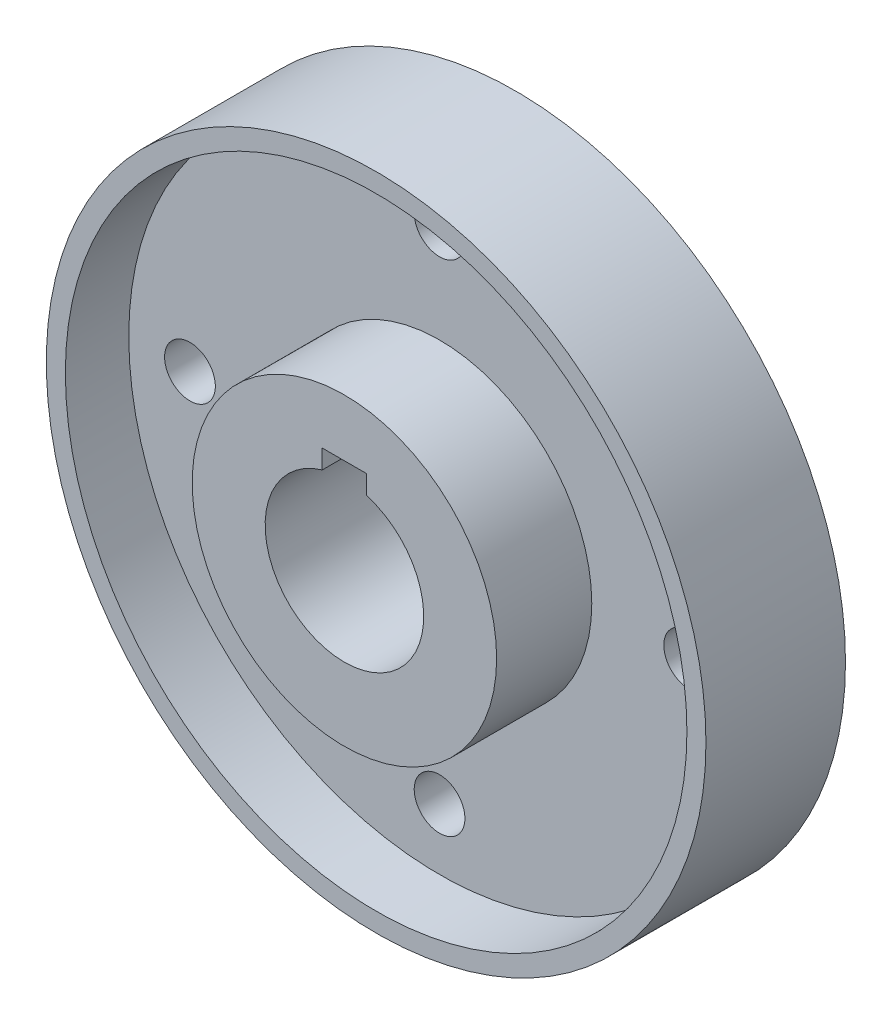
ISO-10303-21;
HEADER;
FILE_DESCRIPTION(('STEP AP214'),'2;1');
FILE_NAME('part.step','',(''),(''),'','','');
FILE_SCHEMA(('AUTOMOTIVE_DESIGN { 1 0 10303 214 1 1 1 1 }'));
ENDSEC;
DATA;
#1=APPLICATION_CONTEXT('core data for automotive mechanical design processes');
#2=APPLICATION_PROTOCOL_DEFINITION('international standard','automotive_design',2000,#1);
#3=PRODUCT_CONTEXT('',#1,'mechanical');
#4=PRODUCT('Part','Part','',(#3));
#5=PRODUCT_RELATED_PRODUCT_CATEGORY('part','',(#4));
#6=PRODUCT_DEFINITION_FORMATION('','',#4);
#7=PRODUCT_DEFINITION_CONTEXT('part definition',#1,'design');
#8=PRODUCT_DEFINITION('design','',#6,#7);
#9=PRODUCT_DEFINITION_SHAPE('','',#8);
#10=(LENGTH_UNIT() NAMED_UNIT(*) SI_UNIT(.MILLI.,.METRE.));
#11=(NAMED_UNIT(*) PLANE_ANGLE_UNIT() SI_UNIT($,.RADIAN.));
#12=(NAMED_UNIT(*) SI_UNIT($,.STERADIAN.) SOLID_ANGLE_UNIT());
#13=UNCERTAINTY_MEASURE_WITH_UNIT(LENGTH_MEASURE(1.E-05),#10,'distance_accuracy_value','');
#14=(GEOMETRIC_REPRESENTATION_CONTEXT(3) GLOBAL_UNCERTAINTY_ASSIGNED_CONTEXT((#13)) GLOBAL_UNIT_ASSIGNED_CONTEXT((#10,
#11,#12)) REPRESENTATION_CONTEXT('',''));
#15=CARTESIAN_POINT('',(0.,0.,0.));
#16=DIRECTION('',(0.,0.,1.));
#17=DIRECTION('',(1.,0.,0.));
#18=AXIS2_PLACEMENT_3D('',#15,#16,#17);
#19=CARTESIAN_POINT('',(0.,104.,0.));
#20=DIRECTION('',(0.,0.,1.));
#21=DIRECTION('',(1.,0.,0.));
#22=AXIS2_PLACEMENT_3D('',#19,#20,#21);
#23=PLANE('',#22);
#24=CARTESIAN_POINT('',(0.,-78.7044474679823,0.));
#25=DIRECTION('',(0.,0.,1.));
#26=DIRECTION('',(-1.,0.,0.));
#27=AXIS2_PLACEMENT_3D('',#24,#25,#26);
#28=CIRCLE('',#27,8.);
#29=CARTESIAN_POINT('',(-8.,-78.7044474679823,0.));
#30=VERTEX_POINT('',#29);
#31=EDGE_CURVE('E143',#30,#30,#28,.T.);
#32=ORIENTED_EDGE('',*,*,#31,.T.);
#33=EDGE_LOOP('',(#32));
#34=FACE_BOUND('',#33,.T.);
#35=CARTESIAN_POINT('',(0.,78.7044474679823,0.));
#36=DIRECTION('',(0.,0.,1.));
#37=DIRECTION('',(1.,0.,0.));
#38=AXIS2_PLACEMENT_3D('',#35,#36,#37);
#39=CIRCLE('',#38,8.);
#40=CARTESIAN_POINT('',(8.,78.7044474679823,0.));
#41=VERTEX_POINT('',#40);
#42=EDGE_CURVE('E137',#41,#41,#39,.T.);
#43=ORIENTED_EDGE('',*,*,#42,.T.);
#44=EDGE_LOOP('',(#43));
#45=FACE_BOUND('',#44,.T.);
#46=CARTESIAN_POINT('',(0.,0.,0.));
#47=DIRECTION('',(0.,0.,1.));
#48=DIRECTION('',(1.,0.,0.));
#49=AXIS2_PLACEMENT_3D('',#46,#47,#48);
#50=CIRCLE('',#49,104.);
#51=CARTESIAN_POINT('',(104.,0.,0.));
#52=VERTEX_POINT('',#51);
#53=EDGE_CURVE('E126',#52,#52,#50,.T.);
#54=ORIENTED_EDGE('',*,*,#53,.F.);
#55=EDGE_LOOP('',(#54));
#56=FACE_BOUND('',#55,.T.);
#57=CARTESIAN_POINT('',(0.,0.,0.));
#58=DIRECTION('',(0.,0.,1.));
#59=DIRECTION('',(1.,0.,0.));
#60=AXIS2_PLACEMENT_3D('',#57,#58,#59);
#61=CIRCLE('',#60,48.);
#62=CARTESIAN_POINT('',(48.,0.,0.));
#63=VERTEX_POINT('',#62);
#64=EDGE_CURVE('E123',#63,#63,#61,.T.);
#65=ORIENTED_EDGE('',*,*,#64,.T.);
#66=EDGE_LOOP('',(#65));
#67=FACE_BOUND('',#66,.T.);
#68=CARTESIAN_POINT('',(-78.7044474679823,-2.7479510961842E-13,0.));
#69=DIRECTION('',(0.,0.,1.));
#70=DIRECTION('',(0.,1.,0.));
#71=AXIS2_PLACEMENT_3D('',#68,#69,#70);
#72=CIRCLE('',#71,8.);
#73=CARTESIAN_POINT('',(-78.7044474679823,7.99999999999973,0.));
#74=VERTEX_POINT('',#73);
#75=EDGE_CURVE('E140',#74,#74,#72,.T.);
#76=ORIENTED_EDGE('',*,*,#75,.T.);
#77=EDGE_LOOP('',(#76));
#78=FACE_BOUND('',#77,.T.);
#79=CARTESIAN_POINT('',(78.7044474679823,8.24385328855259E-13,0.));
#80=DIRECTION('',(0.,0.,1.));
#81=DIRECTION('',(0.,-1.,0.));
#82=AXIS2_PLACEMENT_3D('',#79,#80,#81);
#83=CIRCLE('',#82,8.);
#84=CARTESIAN_POINT('',(78.7044474679824,-7.99999999999918,0.));
#85=VERTEX_POINT('',#84);
#86=EDGE_CURVE('E153',#85,#85,#83,.T.);
#87=ORIENTED_EDGE('',*,*,#86,.T.);
#88=EDGE_LOOP('',(#87));
#89=FACE_BOUND('',#88,.T.);
#90=ADVANCED_FACE('F37',(#34,#45,#56,#67,#78,#89),#23,.F.);
#91=CARTESIAN_POINT('',(0.,48.,24.));
#92=DIRECTION('',(0.,0.,-1.));
#93=DIRECTION('',(-1.,0.,0.));
#94=AXIS2_PLACEMENT_3D('',#91,#92,#93);
#95=PLANE('',#94);
#96=CARTESIAN_POINT('',(0.,-78.7044474679823,24.));
#97=DIRECTION('',(0.,0.,-1.));
#98=DIRECTION('',(-1.,0.,0.));
#99=AXIS2_PLACEMENT_3D('',#96,#97,#98);
#100=CIRCLE('',#99,8.);
#101=CARTESIAN_POINT('',(-8.,-78.7044474679823,24.));
#102=VERTEX_POINT('',#101);
#103=EDGE_CURVE('E141',#102,#102,#100,.F.);
#104=ORIENTED_EDGE('',*,*,#103,.F.);
#105=EDGE_LOOP('',(#104));
#106=FACE_BOUND('',#105,.T.);
#107=CARTESIAN_POINT('',(0.,78.7044474679823,24.));
#108=DIRECTION('',(0.,0.,-1.));
#109=DIRECTION('',(-1.,0.,0.));
#110=AXIS2_PLACEMENT_3D('',#107,#108,#109);
#111=CIRCLE('',#110,8.);
#112=CARTESIAN_POINT('',(-8.,78.7044474679823,24.));
#113=VERTEX_POINT('',#112);
#114=EDGE_CURVE('E94',#113,#113,#111,.F.);
#115=ORIENTED_EDGE('',*,*,#114,.F.);
#116=EDGE_LOOP('',(#115));
#117=FACE_BOUND('',#116,.T.);
#118=CARTESIAN_POINT('',(0.,0.,24.));
#119=DIRECTION('',(0.,0.,1.));
#120=DIRECTION('',(1.,0.,0.));
#121=AXIS2_PLACEMENT_3D('',#118,#119,#120);
#122=CIRCLE('',#121,48.);
#123=CARTESIAN_POINT('',(48.,0.,24.));
#124=VERTEX_POINT('',#123);
#125=EDGE_CURVE('E109',#124,#124,#122,.T.);
#126=ORIENTED_EDGE('',*,*,#125,.F.);
#127=EDGE_LOOP('',(#126));
#128=FACE_BOUND('',#127,.T.);
#129=CARTESIAN_POINT('',(0.,0.,24.));
#130=DIRECTION('',(0.,0.,1.));
#131=DIRECTION('',(1.,0.,0.));
#132=AXIS2_PLACEMENT_3D('',#129,#130,#131);
#133=CIRCLE('',#132,98.);
#134=CARTESIAN_POINT('',(98.,0.,24.));
#135=VERTEX_POINT('',#134);
#136=EDGE_CURVE('E106',#135,#135,#133,.T.);
#137=ORIENTED_EDGE('',*,*,#136,.T.);
#138=EDGE_LOOP('',(#137));
#139=FACE_BOUND('',#138,.T.);
#140=CARTESIAN_POINT('',(-78.7044474679823,-2.7479510961842E-13,24.));
#141=DIRECTION('',(0.,0.,-1.));
#142=DIRECTION('',(-1.,0.,0.));
#143=AXIS2_PLACEMENT_3D('',#140,#141,#142);
#144=CIRCLE('',#143,8.);
#145=CARTESIAN_POINT('',(-86.7044474679823,-2.7479510961842E-13,24.));
#146=VERTEX_POINT('',#145);
#147=EDGE_CURVE('E138',#146,#146,#144,.F.);
#148=ORIENTED_EDGE('',*,*,#147,.F.);
#149=EDGE_LOOP('',(#148));
#150=FACE_BOUND('',#149,.T.);
#151=CARTESIAN_POINT('',(78.7044474679823,8.24385328855259E-13,24.));
#152=DIRECTION('',(0.,0.,-1.));
#153=DIRECTION('',(-1.,0.,0.));
#154=AXIS2_PLACEMENT_3D('',#151,#152,#153);
#155=CIRCLE('',#154,8.);
#156=CARTESIAN_POINT('',(70.7044474679823,8.24385328855259E-13,24.));
#157=VERTEX_POINT('',#156);
#158=EDGE_CURVE('E41',#157,#157,#155,.F.);
#159=ORIENTED_EDGE('',*,*,#158,.F.);
#160=EDGE_LOOP('',(#159));
#161=FACE_BOUND('',#160,.T.);
#162=ADVANCED_FACE('F173',(#106,#117,#128,#139,#150,#161),#95,.F.);
#163=CARTESIAN_POINT('',(0.,48.,5.));
#164=DIRECTION('',(0.,0.,1.));
#165=DIRECTION('',(1.,0.,0.));
#166=AXIS2_PLACEMENT_3D('',#163,#164,#165);
#167=PLANE('',#166);
#168=CARTESIAN_POINT('',(0.,0.,5.));
#169=DIRECTION('',(0.,0.,1.));
#170=DIRECTION('',(1.,0.,0.));
#171=AXIS2_PLACEMENT_3D('',#168,#169,#170);
#172=CIRCLE('',#171,48.);
#173=CARTESIAN_POINT('',(48.,0.,5.));
#174=VERTEX_POINT('',#173);
#175=EDGE_CURVE('E120',#174,#174,#172,.T.);
#176=ORIENTED_EDGE('',*,*,#175,.F.);
#177=EDGE_LOOP('',(#176));
#178=FACE_BOUND('',#177,.T.);
#179=DIRECTION('',(0.,-1.,0.));
#180=VECTOR('',#179,1.);
#181=CARTESIAN_POINT('',(7.,48.,5.));
#182=LINE('',#181,#180);
#183=CARTESIAN_POINT('',(7.,30.,5.));
#184=VERTEX_POINT('',#183);
#185=CARTESIAN_POINT('',(7.,24.,5.));
#186=VERTEX_POINT('',#185);
#187=EDGE_CURVE('E62',#184,#186,#182,.T.);
#188=ORIENTED_EDGE('',*,*,#187,.F.);
#189=DIRECTION('',(1.,0.,0.));
#190=VECTOR('',#189,1.);
#191=CARTESIAN_POINT('',(0.,30.,5.));
#192=LINE('',#191,#190);
#193=CARTESIAN_POINT('',(-7.,30.,5.));
#194=VERTEX_POINT('',#193);
#195=EDGE_CURVE('E86',#194,#184,#192,.T.);
#196=ORIENTED_EDGE('',*,*,#195,.F.);
#197=DIRECTION('',(0.,1.,0.));
#198=VECTOR('',#197,1.);
#199=CARTESIAN_POINT('',(-7.,48.,5.));
#200=LINE('',#199,#198);
#201=CARTESIAN_POINT('',(-7.,24.,5.));
#202=VERTEX_POINT('',#201);
#203=EDGE_CURVE('E78',#202,#194,#200,.T.);
#204=ORIENTED_EDGE('',*,*,#203,.F.);
#205=CARTESIAN_POINT('',(0.,0.,5.));
#206=DIRECTION('',(0.,0.,1.));
#207=DIRECTION('',(1.,0.,0.));
#208=AXIS2_PLACEMENT_3D('',#205,#206,#207);
#209=CIRCLE('',#208,25.);
#210=EDGE_CURVE('E118',#202,#186,#209,.T.);
#211=ORIENTED_EDGE('',*,*,#210,.T.);
#212=EDGE_LOOP('',(#188,#196,#204,#211));
#213=FACE_BOUND('',#212,.T.);
#214=ADVANCED_FACE('F96',(#178,#213),#167,.F.);
#215=CARTESIAN_POINT('',(0.,0.,52.4964718515854));
#216=DIRECTION('',(0.,0.,1.));
#217=DIRECTION('',(1.,0.,0.));
#218=AXIS2_PLACEMENT_3D('',#215,#216,#217);
#219=CYLINDRICAL_SURFACE('',#218,25.);
#220=DIRECTION('',(0.,0.,1.));
#221=VECTOR('',#220,1.);
#222=CARTESIAN_POINT('',(7.,24.,52.4964718515854));
#223=LINE('',#222,#221);
#224=CARTESIAN_POINT('',(7.,24.,54.));
#225=VERTEX_POINT('',#224);
#226=EDGE_CURVE('E97',#186,#225,#223,.T.);
#227=ORIENTED_EDGE('',*,*,#226,.F.);
#228=ORIENTED_EDGE('',*,*,#210,.F.);
#229=DIRECTION('',(0.,0.,1.));
#230=VECTOR('',#229,1.);
#231=CARTESIAN_POINT('',(-7.,24.,52.4964718515854));
#232=LINE('',#231,#230);
#233=CARTESIAN_POINT('',(-7.,24.,54.));
#234=VERTEX_POINT('',#233);
#235=EDGE_CURVE('E81',#234,#202,#232,.F.);
#236=ORIENTED_EDGE('',*,*,#235,.F.);
#237=CARTESIAN_POINT('',(0.,0.,54.));
#238=DIRECTION('',(0.,0.,1.));
#239=DIRECTION('',(1.,0.,0.));
#240=AXIS2_PLACEMENT_3D('',#237,#238,#239);
#241=CIRCLE('',#240,25.);
#242=EDGE_CURVE('E115',#234,#225,#241,.T.);
#243=ORIENTED_EDGE('',*,*,#242,.T.);
#244=EDGE_LOOP('',(#227,#228,#236,#243));
#245=FACE_BOUND('',#244,.T.);
#246=ADVANCED_FACE('F164',(#245),#219,.F.);
#247=CARTESIAN_POINT('',(0.,25.,54.));
#248=DIRECTION('',(0.,0.,-1.));
#249=DIRECTION('',(-1.,0.,0.));
#250=AXIS2_PLACEMENT_3D('',#247,#248,#249);
#251=PLANE('',#250);
#252=CARTESIAN_POINT('',(0.,0.,54.));
#253=DIRECTION('',(0.,0.,1.));
#254=DIRECTION('',(1.,0.,0.));
#255=AXIS2_PLACEMENT_3D('',#252,#253,#254);
#256=CIRCLE('',#255,48.);
#257=CARTESIAN_POINT('',(48.,0.,54.));
#258=VERTEX_POINT('',#257);
#259=EDGE_CURVE('E112',#258,#258,#256,.T.);
#260=ORIENTED_EDGE('',*,*,#259,.T.);
#261=EDGE_LOOP('',(#260));
#262=FACE_BOUND('',#261,.T.);
#263=DIRECTION('',(0.,1.,0.));
#264=VECTOR('',#263,1.);
#265=CARTESIAN_POINT('',(7.,25.,54.));
#266=LINE('',#265,#264);
#267=CARTESIAN_POINT('',(7.,30.,54.));
#268=VERTEX_POINT('',#267);
#269=EDGE_CURVE('E11',#225,#268,#266,.T.);
#270=ORIENTED_EDGE('',*,*,#269,.F.);
#271=ORIENTED_EDGE('',*,*,#242,.F.);
#272=DIRECTION('',(0.,-1.,0.));
#273=VECTOR('',#272,1.);
#274=CARTESIAN_POINT('',(-7.,25.,54.));
#275=LINE('',#274,#273);
#276=CARTESIAN_POINT('',(-7.,30.,54.));
#277=VERTEX_POINT('',#276);
#278=EDGE_CURVE('E132',#277,#234,#275,.T.);
#279=ORIENTED_EDGE('',*,*,#278,.F.);
#280=DIRECTION('',(-1.,0.,0.));
#281=VECTOR('',#280,1.);
#282=CARTESIAN_POINT('',(0.,30.,54.));
#283=LINE('',#282,#281);
#284=EDGE_CURVE('E46',#268,#277,#283,.T.);
#285=ORIENTED_EDGE('',*,*,#284,.F.);
#286=EDGE_LOOP('',(#270,#271,#279,#285));
#287=FACE_BOUND('',#286,.T.);
#288=ADVANCED_FACE('F161',(#262,#287),#251,.F.);
#289=CARTESIAN_POINT('',(0.,98.,44.));
#290=DIRECTION('',(0.,0.,-1.));
#291=DIRECTION('',(-1.,0.,0.));
#292=AXIS2_PLACEMENT_3D('',#289,#290,#291);
#293=PLANE('',#292);
#294=CARTESIAN_POINT('',(0.,0.,44.));
#295=DIRECTION('',(0.,0.,1.));
#296=DIRECTION('',(1.,0.,0.));
#297=AXIS2_PLACEMENT_3D('',#294,#295,#296);
#298=CIRCLE('',#297,98.);
#299=CARTESIAN_POINT('',(98.,0.,44.));
#300=VERTEX_POINT('',#299);
#301=EDGE_CURVE('E103',#300,#300,#298,.T.);
#302=ORIENTED_EDGE('',*,*,#301,.F.);
#303=EDGE_LOOP('',(#302));
#304=FACE_BOUND('',#303,.T.);
#305=CARTESIAN_POINT('',(0.,0.,44.));
#306=DIRECTION('',(0.,0.,1.));
#307=DIRECTION('',(1.,0.,0.));
#308=AXIS2_PLACEMENT_3D('',#305,#306,#307);
#309=CIRCLE('',#308,104.);
#310=CARTESIAN_POINT('',(104.,0.,44.));
#311=VERTEX_POINT('',#310);
#312=EDGE_CURVE('E129',#311,#311,#309,.T.);
#313=ORIENTED_EDGE('',*,*,#312,.T.);
#314=EDGE_LOOP('',(#313));
#315=FACE_BOUND('',#314,.T.);
#316=ADVANCED_FACE('F39',(#304,#315),#293,.F.);
#317=CARTESIAN_POINT('',(0.,0.,52.4964718515854));
#318=DIRECTION('',(0.,0.,1.));
#319=DIRECTION('',(1.,0.,0.));
#320=AXIS2_PLACEMENT_3D('',#317,#318,#319);
#321=CYLINDRICAL_SURFACE('',#320,104.);
#322=ORIENTED_EDGE('',*,*,#312,.F.);
#323=EDGE_LOOP('',(#322));
#324=FACE_BOUND('',#323,.T.);
#325=ORIENTED_EDGE('',*,*,#53,.T.);
#326=EDGE_LOOP('',(#325));
#327=FACE_BOUND('',#326,.T.);
#328=ADVANCED_FACE('F186',(#324,#327),#321,.T.);
#329=CARTESIAN_POINT('',(0.,0.,52.4964718515854));
#330=DIRECTION('',(0.,0.,1.));
#331=DIRECTION('',(1.,0.,0.));
#332=AXIS2_PLACEMENT_3D('',#329,#330,#331);
#333=CYLINDRICAL_SURFACE('',#332,48.);
#334=ORIENTED_EDGE('',*,*,#64,.F.);
#335=EDGE_LOOP('',(#334));
#336=FACE_BOUND('',#335,.T.);
#337=ORIENTED_EDGE('',*,*,#175,.T.);
#338=EDGE_LOOP('',(#337));
#339=FACE_BOUND('',#338,.T.);
#340=ADVANCED_FACE('F185',(#336,#339),#333,.F.);
#341=CARTESIAN_POINT('',(0.,0.,52.4964718515854));
#342=DIRECTION('',(0.,0.,1.));
#343=DIRECTION('',(1.,0.,0.));
#344=AXIS2_PLACEMENT_3D('',#341,#342,#343);
#345=CYLINDRICAL_SURFACE('',#344,48.);
#346=ORIENTED_EDGE('',*,*,#259,.F.);
#347=EDGE_LOOP('',(#346));
#348=FACE_BOUND('',#347,.T.);
#349=ORIENTED_EDGE('',*,*,#125,.T.);
#350=EDGE_LOOP('',(#349));
#351=FACE_BOUND('',#350,.T.);
#352=ADVANCED_FACE('F193',(#348,#351),#345,.T.);
#353=CARTESIAN_POINT('',(0.,0.,52.4964718515854));
#354=DIRECTION('',(0.,0.,1.));
#355=DIRECTION('',(1.,0.,0.));
#356=AXIS2_PLACEMENT_3D('',#353,#354,#355);
#357=CYLINDRICAL_SURFACE('',#356,98.);
#358=ORIENTED_EDGE('',*,*,#136,.F.);
#359=EDGE_LOOP('',(#358));
#360=FACE_BOUND('',#359,.T.);
#361=ORIENTED_EDGE('',*,*,#301,.T.);
#362=EDGE_LOOP('',(#361));
#363=FACE_BOUND('',#362,.T.);
#364=ADVANCED_FACE('F235',(#360,#363),#357,.F.);
#365=CARTESIAN_POINT('',(7.,30.,146.));
#366=DIRECTION('',(-1.,0.,0.));
#367=DIRECTION('',(0.,0.,1.));
#368=AXIS2_PLACEMENT_3D('',#365,#366,#367);
#369=PLANE('',#368);
#370=ORIENTED_EDGE('',*,*,#187,.T.);
#371=ORIENTED_EDGE('',*,*,#226,.T.);
#372=ORIENTED_EDGE('',*,*,#269,.T.);
#373=DIRECTION('',(0.,0.,-1.));
#374=VECTOR('',#373,1.);
#375=CARTESIAN_POINT('',(7.,30.,146.));
#376=LINE('',#375,#374);
#377=EDGE_CURVE('E93',#268,#184,#376,.T.);
#378=ORIENTED_EDGE('',*,*,#377,.T.);
#379=EDGE_LOOP('',(#370,#371,#372,#378));
#380=FACE_BOUND('',#379,.T.);
#381=ADVANCED_FACE('F158',(#380),#369,.T.);
#382=CARTESIAN_POINT('',(-7.,30.,146.));
#383=DIRECTION('',(0.,-1.,0.));
#384=DIRECTION('',(0.,0.,-1.));
#385=AXIS2_PLACEMENT_3D('',#382,#383,#384);
#386=PLANE('',#385);
#387=ORIENTED_EDGE('',*,*,#195,.T.);
#388=ORIENTED_EDGE('',*,*,#377,.F.);
#389=ORIENTED_EDGE('',*,*,#284,.T.);
#390=DIRECTION('',(0.,0.,-1.));
#391=VECTOR('',#390,1.);
#392=CARTESIAN_POINT('',(-7.,30.,146.));
#393=LINE('',#392,#391);
#394=EDGE_CURVE('E54',#277,#194,#393,.T.);
#395=ORIENTED_EDGE('',*,*,#394,.T.);
#396=EDGE_LOOP('',(#387,#388,#389,#395));
#397=FACE_BOUND('',#396,.T.);
#398=ADVANCED_FACE('F89',(#397),#386,.T.);
#399=CARTESIAN_POINT('',(-7.,30.,146.));
#400=DIRECTION('',(1.,0.,0.));
#401=DIRECTION('',(0.,1.,0.));
#402=AXIS2_PLACEMENT_3D('',#399,#400,#401);
#403=PLANE('',#402);
#404=ORIENTED_EDGE('',*,*,#203,.T.);
#405=ORIENTED_EDGE('',*,*,#394,.F.);
#406=ORIENTED_EDGE('',*,*,#278,.T.);
#407=ORIENTED_EDGE('',*,*,#235,.T.);
#408=EDGE_LOOP('',(#404,#405,#406,#407));
#409=FACE_BOUND('',#408,.T.);
#410=ADVANCED_FACE('F79',(#409),#403,.T.);
#411=CARTESIAN_POINT('',(0.,78.7044474679823,217.));
#412=DIRECTION('',(0.,0.,-1.));
#413=DIRECTION('',(-1.,0.,0.));
#414=AXIS2_PLACEMENT_3D('',#411,#412,#413);
#415=CYLINDRICAL_SURFACE('',#414,8.);
#416=ORIENTED_EDGE('',*,*,#42,.F.);
#417=EDGE_LOOP('',(#416));
#418=FACE_BOUND('',#417,.T.);
#419=ORIENTED_EDGE('',*,*,#114,.T.);
#420=EDGE_LOOP('',(#419));
#421=FACE_BOUND('',#420,.T.);
#422=ADVANCED_FACE('F224',(#418,#421),#415,.F.);
#423=CARTESIAN_POINT('',(-78.7044474679823,-2.7479510961842E-13,217.));
#424=DIRECTION('',(0.,0.,-1.));
#425=DIRECTION('',(-1.,0.,0.));
#426=AXIS2_PLACEMENT_3D('',#423,#424,#425);
#427=CYLINDRICAL_SURFACE('',#426,8.);
#428=ORIENTED_EDGE('',*,*,#75,.F.);
#429=EDGE_LOOP('',(#428));
#430=FACE_BOUND('',#429,.T.);
#431=ORIENTED_EDGE('',*,*,#147,.T.);
#432=EDGE_LOOP('',(#431));
#433=FACE_BOUND('',#432,.T.);
#434=ADVANCED_FACE('F218',(#430,#433),#427,.F.);
#435=CARTESIAN_POINT('',(0.,-78.7044474679823,217.));
#436=DIRECTION('',(0.,0.,-1.));
#437=DIRECTION('',(-1.,0.,0.));
#438=AXIS2_PLACEMENT_3D('',#435,#436,#437);
#439=CYLINDRICAL_SURFACE('',#438,8.);
#440=ORIENTED_EDGE('',*,*,#31,.F.);
#441=EDGE_LOOP('',(#440));
#442=FACE_BOUND('',#441,.T.);
#443=ORIENTED_EDGE('',*,*,#103,.T.);
#444=EDGE_LOOP('',(#443));
#445=FACE_BOUND('',#444,.T.);
#446=ADVANCED_FACE('F211',(#442,#445),#439,.F.);
#447=CARTESIAN_POINT('',(78.7044474679823,8.24385328855259E-13,217.));
#448=DIRECTION('',(0.,0.,-1.));
#449=DIRECTION('',(-1.,0.,0.));
#450=AXIS2_PLACEMENT_3D('',#447,#448,#449);
#451=CYLINDRICAL_SURFACE('',#450,8.);
#452=ORIENTED_EDGE('',*,*,#86,.F.);
#453=EDGE_LOOP('',(#452));
#454=FACE_BOUND('',#453,.T.);
#455=ORIENTED_EDGE('',*,*,#158,.T.);
#456=EDGE_LOOP('',(#455));
#457=FACE_BOUND('',#456,.T.);
#458=ADVANCED_FACE('F208',(#454,#457),#451,.F.);
#459=CLOSED_SHELL('',(#90,#162,#214,#246,#288,#316,#328,#340,#352,#364,#381,#398,#410,#422,#434,
#446,#458));
#460=MANIFOLD_SOLID_BREP('B2',#459);
#461=ADVANCED_BREP_SHAPE_REPRESENTATION('',(#18,#460),#14);
#462=SHAPE_DEFINITION_REPRESENTATION(#9,#461);
ENDSEC;
END-ISO-10303-21;
